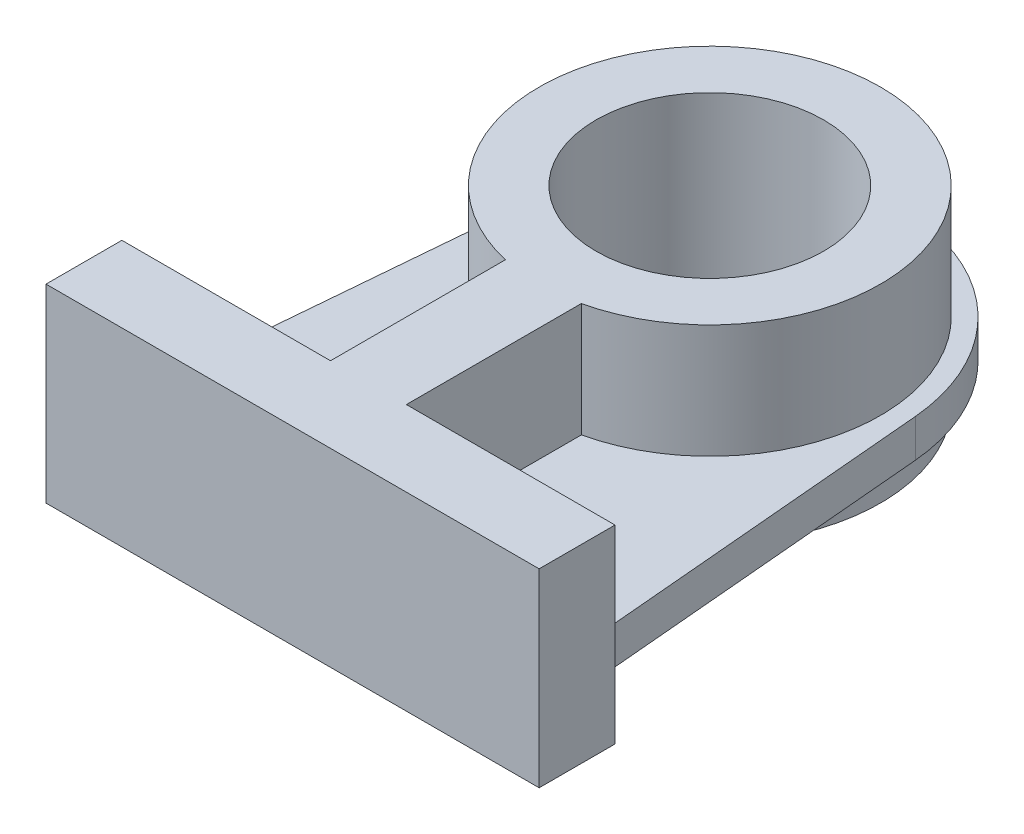
ISO-10303-21;
HEADER;
FILE_DESCRIPTION(('STEP AP214'),'2;1');
FILE_NAME('part.step','',(''),(''),'','','');
FILE_SCHEMA(('AUTOMOTIVE_DESIGN { 1 0 10303 214 1 1 1 1 }'));
ENDSEC;
DATA;
#1=APPLICATION_CONTEXT('core data for automotive mechanical design processes');
#2=APPLICATION_PROTOCOL_DEFINITION('international standard','automotive_design',2000,#1);
#3=PRODUCT_CONTEXT('',#1,'mechanical');
#4=PRODUCT('Part','Part','',(#3));
#5=PRODUCT_RELATED_PRODUCT_CATEGORY('part','',(#4));
#6=PRODUCT_DEFINITION_FORMATION('','',#4);
#7=PRODUCT_DEFINITION_CONTEXT('part definition',#1,'design');
#8=PRODUCT_DEFINITION('design','',#6,#7);
#9=PRODUCT_DEFINITION_SHAPE('','',#8);
#10=(LENGTH_UNIT() NAMED_UNIT(*) SI_UNIT(.MILLI.,.METRE.));
#11=(NAMED_UNIT(*) PLANE_ANGLE_UNIT() SI_UNIT($,.RADIAN.));
#12=(NAMED_UNIT(*) SI_UNIT($,.STERADIAN.) SOLID_ANGLE_UNIT());
#13=UNCERTAINTY_MEASURE_WITH_UNIT(LENGTH_MEASURE(1.E-05),#10,'distance_accuracy_value','');
#14=(GEOMETRIC_REPRESENTATION_CONTEXT(3) GLOBAL_UNCERTAINTY_ASSIGNED_CONTEXT((#13)) GLOBAL_UNIT_ASSIGNED_CONTEXT((#10,
#11,#12)) REPRESENTATION_CONTEXT('',''));
#15=CARTESIAN_POINT('',(0.,0.,0.));
#16=DIRECTION('',(0.,0.,1.));
#17=DIRECTION('',(1.,0.,0.));
#18=AXIS2_PLACEMENT_3D('',#15,#16,#17);
#19=CARTESIAN_POINT('',(0.,25.,0.));
#20=DIRECTION('',(0.,-1.,0.));
#21=DIRECTION('',(0.,0.,-1.));
#22=AXIS2_PLACEMENT_3D('',#19,#20,#21);
#23=CYLINDRICAL_SURFACE('',#22,22.5);
#24=CARTESIAN_POINT('',(0.,5.,0.));
#25=DIRECTION('',(0.,1.,0.));
#26=DIRECTION('',(0.,0.,1.));
#27=AXIS2_PLACEMENT_3D('',#24,#25,#26);
#28=CIRCLE('',#27,22.5);
#29=CARTESIAN_POINT('',(4.99999999999999,5.,21.9374109684803));
#30=VERTEX_POINT('',#29);
#31=CARTESIAN_POINT('',(-5.00000000000001,5.,21.9374109684803));
#32=VERTEX_POINT('',#31);
#33=EDGE_CURVE('E206',#30,#32,#28,.T.);
#34=ORIENTED_EDGE('',*,*,#33,.F.);
#35=DIRECTION('',(0.,-1.,0.));
#36=VECTOR('',#35,1.);
#37=CARTESIAN_POINT('',(4.99999999999999,25.,21.9374109684803));
#38=LINE('',#37,#36);
#39=CARTESIAN_POINT('',(4.99999999999999,0.,21.9374109684803));
#40=VERTEX_POINT('',#39);
#41=EDGE_CURVE('E107',#30,#40,#38,.T.);
#42=ORIENTED_EDGE('',*,*,#41,.T.);
#43=CARTESIAN_POINT('',(0.,0.,0.));
#44=DIRECTION('',(0.,1.,0.));
#45=DIRECTION('',(0.,0.,1.));
#46=AXIS2_PLACEMENT_3D('',#43,#44,#45);
#47=CIRCLE('',#46,22.5);
#48=CARTESIAN_POINT('',(-5.00000000000001,0.,21.9374109684803));
#49=VERTEX_POINT('',#48);
#50=EDGE_CURVE('E189',#40,#49,#47,.T.);
#51=ORIENTED_EDGE('',*,*,#50,.T.);
#52=DIRECTION('',(0.,-1.,0.));
#53=VECTOR('',#52,1.);
#54=CARTESIAN_POINT('',(-5.00000000000001,25.,21.9374109684803));
#55=LINE('',#54,#53);
#56=EDGE_CURVE('E56',#32,#49,#55,.T.);
#57=ORIENTED_EDGE('',*,*,#56,.F.);
#58=EDGE_LOOP('',(#34,#42,#51,#57));
#59=FACE_BOUND('',#58,.T.);
#60=ADVANCED_FACE('F47',(#59),#23,.T.);
#61=CARTESIAN_POINT('',(-5.00000000000001,25.,0.));
#62=DIRECTION('',(1.,0.,0.));
#63=DIRECTION('',(0.,0.,-1.));
#64=AXIS2_PLACEMENT_3D('',#61,#62,#63);
#65=PLANE('',#64);
#66=DIRECTION('',(0.,0.,1.));
#67=VECTOR('',#66,1.);
#68=CARTESIAN_POINT('',(-5.00000000000001,5.,0.));
#69=LINE('',#68,#67);
#70=CARTESIAN_POINT('',(-5.00000000000001,5.,45.));
#71=VERTEX_POINT('',#70);
#72=EDGE_CURVE('E210',#32,#71,#69,.T.);
#73=ORIENTED_EDGE('',*,*,#72,.F.);
#74=ORIENTED_EDGE('',*,*,#56,.T.);
#75=DIRECTION('',(0.,0.,1.));
#76=VECTOR('',#75,1.);
#77=CARTESIAN_POINT('',(-5.00000000000001,0.,0.));
#78=LINE('',#77,#76);
#79=CARTESIAN_POINT('',(-5.00000000000001,0.,45.));
#80=VERTEX_POINT('',#79);
#81=EDGE_CURVE('E342',#49,#80,#78,.T.);
#82=ORIENTED_EDGE('',*,*,#81,.T.);
#83=DIRECTION('',(0.,-1.,0.));
#84=VECTOR('',#83,1.);
#85=CARTESIAN_POINT('',(-5.00000000000001,25.,45.));
#86=LINE('',#85,#84);
#87=EDGE_CURVE('E329',#71,#80,#86,.T.);
#88=ORIENTED_EDGE('',*,*,#87,.F.);
#89=EDGE_LOOP('',(#73,#74,#82,#88));
#90=FACE_BOUND('',#89,.T.);
#91=ADVANCED_FACE('F343',(#90),#65,.F.);
#92=CARTESIAN_POINT('',(4.99999999999999,25.,0.));
#93=DIRECTION('',(1.,0.,0.));
#94=DIRECTION('',(0.,0.,-1.));
#95=AXIS2_PLACEMENT_3D('',#92,#93,#94);
#96=PLANE('',#95);
#97=ORIENTED_EDGE('',*,*,#41,.F.);
#98=DIRECTION('',(0.,0.,1.));
#99=VECTOR('',#98,1.);
#100=CARTESIAN_POINT('',(4.99999999999999,5.,0.));
#101=LINE('',#100,#99);
#102=CARTESIAN_POINT('',(5.,5.,45.));
#103=VERTEX_POINT('',#102);
#104=EDGE_CURVE('E203',#30,#103,#101,.T.);
#105=ORIENTED_EDGE('',*,*,#104,.T.);
#106=DIRECTION('',(0.,-1.,0.));
#107=VECTOR('',#106,1.);
#108=CARTESIAN_POINT('',(5.,25.,45.));
#109=LINE('',#108,#107);
#110=CARTESIAN_POINT('',(5.,0.,45.));
#111=VERTEX_POINT('',#110);
#112=EDGE_CURVE('E272',#103,#111,#109,.T.);
#113=ORIENTED_EDGE('',*,*,#112,.T.);
#114=DIRECTION('',(0.,0.,1.));
#115=VECTOR('',#114,1.);
#116=CARTESIAN_POINT('',(4.99999999999999,0.,0.));
#117=LINE('',#116,#115);
#118=EDGE_CURVE('E360',#40,#111,#117,.T.);
#119=ORIENTED_EDGE('',*,*,#118,.F.);
#120=EDGE_LOOP('',(#97,#105,#113,#119));
#121=FACE_BOUND('',#120,.T.);
#122=ADVANCED_FACE('F383',(#121),#96,.T.);
#123=CARTESIAN_POINT('',(4.99999999999999,25.,21.9374109684803));
#124=VERTEX_POINT('',#123);
#125=CARTESIAN_POINT('',(4.99999999999999,10.,21.9374109684803));
#126=VERTEX_POINT('',#125);
#127=EDGE_CURVE('E72',#124,#126,#38,.T.);
#128=ORIENTED_EDGE('',*,*,#127,.T.);
#129=CARTESIAN_POINT('',(0.,10.,0.));
#130=DIRECTION('',(0.,1.,0.));
#131=DIRECTION('',(0.,0.,1.));
#132=AXIS2_PLACEMENT_3D('',#129,#130,#131);
#133=CIRCLE('',#132,22.5);
#134=CARTESIAN_POINT('',(-5.00000000000001,10.,21.9374109684803));
#135=VERTEX_POINT('',#134);
#136=EDGE_CURVE('E233',#126,#135,#133,.T.);
#137=ORIENTED_EDGE('',*,*,#136,.T.);
#138=CARTESIAN_POINT('',(-5.00000000000001,25.,21.9374109684803));
#139=VERTEX_POINT('',#138);
#140=EDGE_CURVE('E11',#139,#135,#55,.T.);
#141=ORIENTED_EDGE('',*,*,#140,.F.);
#142=CARTESIAN_POINT('',(0.,25.,0.));
#143=DIRECTION('',(0.,1.,0.));
#144=DIRECTION('',(0.,0.,1.));
#145=AXIS2_PLACEMENT_3D('',#142,#143,#144);
#146=CIRCLE('',#145,22.5);
#147=EDGE_CURVE('E180',#124,#139,#146,.T.);
#148=ORIENTED_EDGE('',*,*,#147,.F.);
#149=EDGE_LOOP('',(#128,#137,#141,#148));
#150=FACE_BOUND('',#149,.T.);
#151=ADVANCED_FACE('F49',(#150),#23,.T.);
#152=ORIENTED_EDGE('',*,*,#140,.T.);
#153=DIRECTION('',(0.,0.,1.));
#154=VECTOR('',#153,1.);
#155=CARTESIAN_POINT('',(-5.00000000000001,10.,0.));
#156=LINE('',#155,#154);
#157=CARTESIAN_POINT('',(-5.00000000000001,10.,45.));
#158=VERTEX_POINT('',#157);
#159=EDGE_CURVE('E237',#135,#158,#156,.T.);
#160=ORIENTED_EDGE('',*,*,#159,.T.);
#161=CARTESIAN_POINT('',(-5.00000000000001,25.,45.));
#162=VERTEX_POINT('',#161);
#163=EDGE_CURVE('E311',#162,#158,#86,.T.);
#164=ORIENTED_EDGE('',*,*,#163,.F.);
#165=DIRECTION('',(0.,0.,1.));
#166=VECTOR('',#165,1.);
#167=CARTESIAN_POINT('',(-5.00000000000001,25.,0.));
#168=LINE('',#167,#166);
#169=EDGE_CURVE('E115',#139,#162,#168,.T.);
#170=ORIENTED_EDGE('',*,*,#169,.F.);
#171=EDGE_LOOP('',(#152,#160,#164,#170));
#172=FACE_BOUND('',#171,.T.);
#173=ADVANCED_FACE('F312',(#172),#65,.F.);
#174=CARTESIAN_POINT('',(0.,25.,45.));
#175=DIRECTION('',(0.,0.,1.));
#176=DIRECTION('',(1.,0.,0.));
#177=AXIS2_PLACEMENT_3D('',#174,#175,#176);
#178=PLANE('',#177);
#179=ORIENTED_EDGE('',*,*,#163,.T.);
#180=DIRECTION('',(-1.,0.,0.));
#181=VECTOR('',#180,1.);
#182=CARTESIAN_POINT('',(0.,10.,45.));
#183=LINE('',#182,#181);
#184=CARTESIAN_POINT('',(-29.0324857972501,10.,45.));
#185=VERTEX_POINT('',#184);
#186=EDGE_CURVE('E241',#158,#185,#183,.T.);
#187=ORIENTED_EDGE('',*,*,#186,.T.);
#188=DIRECTION('',(0.,-1.,0.));
#189=VECTOR('',#188,1.);
#190=CARTESIAN_POINT('',(-29.0324857972501,10.,45.));
#191=LINE('',#190,#189);
#192=CARTESIAN_POINT('',(-29.0324857972501,5.,45.));
#193=VERTEX_POINT('',#192);
#194=EDGE_CURVE('E194',#185,#193,#191,.T.);
#195=ORIENTED_EDGE('',*,*,#194,.T.);
#196=DIRECTION('',(-1.,0.,0.));
#197=VECTOR('',#196,1.);
#198=CARTESIAN_POINT('',(0.,5.,45.));
#199=LINE('',#198,#197);
#200=EDGE_CURVE('E214',#71,#193,#199,.T.);
#201=ORIENTED_EDGE('',*,*,#200,.F.);
#202=ORIENTED_EDGE('',*,*,#87,.T.);
#203=DIRECTION('',(-1.,0.,0.));
#204=VECTOR('',#203,1.);
#205=CARTESIAN_POINT('',(0.,0.,45.));
#206=LINE('',#205,#204);
#207=CARTESIAN_POINT('',(-32.5,0.,45.));
#208=VERTEX_POINT('',#207);
#209=EDGE_CURVE('E337',#80,#208,#206,.T.);
#210=ORIENTED_EDGE('',*,*,#209,.T.);
#211=DIRECTION('',(0.,-1.,0.));
#212=VECTOR('',#211,1.);
#213=CARTESIAN_POINT('',(-32.5,25.,45.));
#214=LINE('',#213,#212);
#215=CARTESIAN_POINT('',(-32.5,25.,45.));
#216=VERTEX_POINT('',#215);
#217=EDGE_CURVE('E327',#216,#208,#214,.T.);
#218=ORIENTED_EDGE('',*,*,#217,.F.);
#219=DIRECTION('',(-1.,0.,0.));
#220=VECTOR('',#219,1.);
#221=CARTESIAN_POINT('',(0.,25.,45.));
#222=LINE('',#221,#220);
#223=EDGE_CURVE('E167',#162,#216,#222,.T.);
#224=ORIENTED_EDGE('',*,*,#223,.F.);
#225=EDGE_LOOP('',(#179,#187,#195,#201,#202,#210,#218,#224));
#226=FACE_BOUND('',#225,.T.);
#227=ADVANCED_FACE('F310',(#226),#178,.F.);
#228=CARTESIAN_POINT('',(-32.5,25.,0.));
#229=DIRECTION('',(-1.,0.,0.));
#230=DIRECTION('',(0.,0.,1.));
#231=AXIS2_PLACEMENT_3D('',#228,#229,#230);
#232=PLANE('',#231);
#233=DIRECTION('',(0.,0.,-1.));
#234=VECTOR('',#233,1.);
#235=CARTESIAN_POINT('',(-32.5,0.,0.));
#236=LINE('',#235,#234);
#237=CARTESIAN_POINT('',(-32.5,0.,55.));
#238=VERTEX_POINT('',#237);
#239=EDGE_CURVE('E352',#238,#208,#236,.T.);
#240=ORIENTED_EDGE('',*,*,#239,.F.);
#241=DIRECTION('',(0.,-1.,0.));
#242=VECTOR('',#241,1.);
#243=CARTESIAN_POINT('',(-32.5,25.,55.));
#244=LINE('',#243,#242);
#245=CARTESIAN_POINT('',(-32.5,25.,55.));
#246=VERTEX_POINT('',#245);
#247=EDGE_CURVE('E324',#246,#238,#244,.T.);
#248=ORIENTED_EDGE('',*,*,#247,.F.);
#249=DIRECTION('',(0.,0.,-1.));
#250=VECTOR('',#249,1.);
#251=CARTESIAN_POINT('',(-32.5,25.,0.));
#252=LINE('',#251,#250);
#253=EDGE_CURVE('E174',#246,#216,#252,.T.);
#254=ORIENTED_EDGE('',*,*,#253,.T.);
#255=ORIENTED_EDGE('',*,*,#217,.T.);
#256=EDGE_LOOP('',(#240,#248,#254,#255));
#257=FACE_BOUND('',#256,.T.);
#258=ADVANCED_FACE('F406',(#257),#232,.T.);
#259=CARTESIAN_POINT('',(0.,25.,55.));
#260=DIRECTION('',(0.,0.,1.));
#261=DIRECTION('',(1.,0.,0.));
#262=AXIS2_PLACEMENT_3D('',#259,#260,#261);
#263=PLANE('',#262);
#264=DIRECTION('',(-1.,0.,0.));
#265=VECTOR('',#264,1.);
#266=CARTESIAN_POINT('',(0.,0.,55.));
#267=LINE('',#266,#265);
#268=CARTESIAN_POINT('',(32.5,0.,55.));
#269=VERTEX_POINT('',#268);
#270=EDGE_CURVE('E357',#269,#238,#267,.T.);
#271=ORIENTED_EDGE('',*,*,#270,.F.);
#272=DIRECTION('',(0.,-1.,0.));
#273=VECTOR('',#272,1.);
#274=CARTESIAN_POINT('',(32.5,25.,55.));
#275=LINE('',#274,#273);
#276=CARTESIAN_POINT('',(32.5,25.,55.));
#277=VERTEX_POINT('',#276);
#278=EDGE_CURVE('E157',#277,#269,#275,.T.);
#279=ORIENTED_EDGE('',*,*,#278,.F.);
#280=DIRECTION('',(-1.,0.,0.));
#281=VECTOR('',#280,1.);
#282=CARTESIAN_POINT('',(0.,25.,55.));
#283=LINE('',#282,#281);
#284=EDGE_CURVE('E144',#277,#246,#283,.T.);
#285=ORIENTED_EDGE('',*,*,#284,.T.);
#286=ORIENTED_EDGE('',*,*,#247,.T.);
#287=EDGE_LOOP('',(#271,#279,#285,#286));
#288=FACE_BOUND('',#287,.T.);
#289=ADVANCED_FACE('F403',(#288),#263,.T.);
#290=CARTESIAN_POINT('',(32.4999999999999,25.,0.));
#291=DIRECTION('',(-1.,0.,0.));
#292=DIRECTION('',(0.,0.,1.));
#293=AXIS2_PLACEMENT_3D('',#290,#291,#292);
#294=PLANE('',#293);
#295=DIRECTION('',(0.,0.,-1.));
#296=VECTOR('',#295,1.);
#297=CARTESIAN_POINT('',(32.4999999999999,0.,0.));
#298=LINE('',#297,#296);
#299=CARTESIAN_POINT('',(32.5,0.,45.));
#300=VERTEX_POINT('',#299);
#301=EDGE_CURVE('E152',#269,#300,#298,.T.);
#302=ORIENTED_EDGE('',*,*,#301,.T.);
#303=DIRECTION('',(0.,-1.,0.));
#304=VECTOR('',#303,1.);
#305=CARTESIAN_POINT('',(32.5,25.,45.));
#306=LINE('',#305,#304);
#307=CARTESIAN_POINT('',(32.5,25.,45.));
#308=VERTEX_POINT('',#307);
#309=EDGE_CURVE('E149',#308,#300,#306,.T.);
#310=ORIENTED_EDGE('',*,*,#309,.F.);
#311=DIRECTION('',(0.,0.,-1.));
#312=VECTOR('',#311,1.);
#313=CARTESIAN_POINT('',(32.4999999999999,25.,0.));
#314=LINE('',#313,#312);
#315=EDGE_CURVE('E134',#277,#308,#314,.T.);
#316=ORIENTED_EDGE('',*,*,#315,.F.);
#317=ORIENTED_EDGE('',*,*,#278,.T.);
#318=EDGE_LOOP('',(#302,#310,#316,#317));
#319=FACE_BOUND('',#318,.T.);
#320=ADVANCED_FACE('F150',(#319),#294,.F.);
#321=DIRECTION('',(0.,-1.,0.));
#322=VECTOR('',#321,1.);
#323=CARTESIAN_POINT('',(29.0324857972501,10.,45.));
#324=LINE('',#323,#322);
#325=CARTESIAN_POINT('',(29.0324857972501,10.,45.));
#326=VERTEX_POINT('',#325);
#327=CARTESIAN_POINT('',(29.0324857972501,5.,45.));
#328=VERTEX_POINT('',#327);
#329=EDGE_CURVE('E198',#326,#328,#324,.T.);
#330=ORIENTED_EDGE('',*,*,#329,.F.);
#331=CARTESIAN_POINT('',(5.,10.,45.));
#332=VERTEX_POINT('',#331);
#333=EDGE_CURVE('E202',#326,#332,#183,.T.);
#334=ORIENTED_EDGE('',*,*,#333,.T.);
#335=CARTESIAN_POINT('',(5.,25.,45.));
#336=VERTEX_POINT('',#335);
#337=EDGE_CURVE('E158',#336,#332,#109,.T.);
#338=ORIENTED_EDGE('',*,*,#337,.F.);
#339=EDGE_CURVE('E140',#308,#336,#222,.T.);
#340=ORIENTED_EDGE('',*,*,#339,.F.);
#341=ORIENTED_EDGE('',*,*,#309,.T.);
#342=EDGE_CURVE('E355',#300,#111,#206,.T.);
#343=ORIENTED_EDGE('',*,*,#342,.T.);
#344=ORIENTED_EDGE('',*,*,#112,.F.);
#345=EDGE_CURVE('E63',#328,#103,#199,.T.);
#346=ORIENTED_EDGE('',*,*,#345,.F.);
#347=EDGE_LOOP('',(#330,#334,#338,#340,#341,#343,#344,#346));
#348=FACE_BOUND('',#347,.T.);
#349=ADVANCED_FACE('F161',(#348),#178,.F.);
#350=DIRECTION('',(0.,0.,1.));
#351=VECTOR('',#350,1.);
#352=CARTESIAN_POINT('',(4.99999999999999,10.,0.));
#353=LINE('',#352,#351);
#354=EDGE_CURVE('E229',#126,#332,#353,.T.);
#355=ORIENTED_EDGE('',*,*,#354,.F.);
#356=ORIENTED_EDGE('',*,*,#127,.F.);
#357=DIRECTION('',(0.,0.,1.));
#358=VECTOR('',#357,1.);
#359=CARTESIAN_POINT('',(4.99999999999999,25.,0.));
#360=LINE('',#359,#358);
#361=EDGE_CURVE('E165',#124,#336,#360,.T.);
#362=ORIENTED_EDGE('',*,*,#361,.T.);
#363=ORIENTED_EDGE('',*,*,#337,.T.);
#364=EDGE_LOOP('',(#355,#356,#362,#363));
#365=FACE_BOUND('',#364,.T.);
#366=ADVANCED_FACE('F315',(#365),#96,.T.);
#367=CARTESIAN_POINT('',(0.,25.,0.));
#368=DIRECTION('',(0.,-1.,0.));
#369=DIRECTION('',(0.,0.,-1.));
#370=AXIS2_PLACEMENT_3D('',#367,#368,#369);
#371=CYLINDRICAL_SURFACE('',#370,15.);
#372=CARTESIAN_POINT('',(0.,25.,0.));
#373=DIRECTION('',(0.,1.,0.));
#374=DIRECTION('',(0.,0.,1.));
#375=AXIS2_PLACEMENT_3D('',#372,#373,#374);
#376=CIRCLE('',#375,15.);
#377=CARTESIAN_POINT('',(0.,25.,15.));
#378=VERTEX_POINT('',#377);
#379=EDGE_CURVE('E169',#378,#378,#376,.T.);
#380=ORIENTED_EDGE('',*,*,#379,.T.);
#381=EDGE_LOOP('',(#380));
#382=FACE_BOUND('',#381,.T.);
#383=CARTESIAN_POINT('',(0.,0.,0.));
#384=DIRECTION('',(0.,1.,0.));
#385=DIRECTION('',(0.,0.,1.));
#386=AXIS2_PLACEMENT_3D('',#383,#384,#385);
#387=CIRCLE('',#386,15.);
#388=CARTESIAN_POINT('',(0.,0.,15.));
#389=VERTEX_POINT('',#388);
#390=EDGE_CURVE('E182',#389,#389,#387,.T.);
#391=ORIENTED_EDGE('',*,*,#390,.F.);
#392=EDGE_LOOP('',(#391));
#393=FACE_BOUND('',#392,.T.);
#394=ADVANCED_FACE('F372',(#382,#393),#371,.F.);
#395=CARTESIAN_POINT('',(0.,25.,0.));
#396=DIRECTION('',(0.,1.,0.));
#397=DIRECTION('',(0.,0.,1.));
#398=AXIS2_PLACEMENT_3D('',#395,#396,#397);
#399=PLANE('',#398);
#400=ORIENTED_EDGE('',*,*,#147,.T.);
#401=ORIENTED_EDGE('',*,*,#169,.T.);
#402=ORIENTED_EDGE('',*,*,#223,.T.);
#403=ORIENTED_EDGE('',*,*,#253,.F.);
#404=ORIENTED_EDGE('',*,*,#284,.F.);
#405=ORIENTED_EDGE('',*,*,#315,.T.);
#406=ORIENTED_EDGE('',*,*,#339,.T.);
#407=ORIENTED_EDGE('',*,*,#361,.F.);
#408=EDGE_LOOP('',(#400,#401,#402,#403,#404,#405,#406,#407));
#409=FACE_BOUND('',#408,.T.);
#410=ORIENTED_EDGE('',*,*,#379,.F.);
#411=EDGE_LOOP('',(#410));
#412=FACE_BOUND('',#411,.T.);
#413=ADVANCED_FACE('F136',(#409,#412),#399,.T.);
#414=CARTESIAN_POINT('',(0.,0.,0.));
#415=DIRECTION('',(0.,1.,0.));
#416=DIRECTION('',(0.,0.,1.));
#417=AXIS2_PLACEMENT_3D('',#414,#415,#416);
#418=PLANE('',#417);
#419=ORIENTED_EDGE('',*,*,#50,.F.);
#420=ORIENTED_EDGE('',*,*,#118,.T.);
#421=ORIENTED_EDGE('',*,*,#342,.F.);
#422=ORIENTED_EDGE('',*,*,#301,.F.);
#423=ORIENTED_EDGE('',*,*,#270,.T.);
#424=ORIENTED_EDGE('',*,*,#239,.T.);
#425=ORIENTED_EDGE('',*,*,#209,.F.);
#426=ORIENTED_EDGE('',*,*,#81,.F.);
#427=EDGE_LOOP('',(#419,#420,#421,#422,#423,#424,#425,#426));
#428=FACE_BOUND('',#427,.T.);
#429=ORIENTED_EDGE('',*,*,#390,.T.);
#430=EDGE_LOOP('',(#429));
#431=FACE_BOUND('',#430,.T.);
#432=ADVANCED_FACE('F348',(#428,#431),#418,.F.);
#433=CARTESIAN_POINT('',(24.9048674522936,10.,-2.17889356869136));
#434=DIRECTION('',(0.996194698091746,0.,-0.0871557427476544));
#435=DIRECTION('',(-0.0871557427476544,0.,-0.996194698091746));
#436=AXIS2_PLACEMENT_3D('',#433,#434,#435);
#437=PLANE('',#436);
#438=DIRECTION('',(0.0871557427476544,0.,0.996194698091746));
#439=VECTOR('',#438,1.);
#440=CARTESIAN_POINT('',(24.9048674522936,5.,-2.17889356869136));
#441=LINE('',#440,#439);
#442=CARTESIAN_POINT('',(24.9048674522936,5.,-2.17889356869136));
#443=VERTEX_POINT('',#442);
#444=EDGE_CURVE('E226',#443,#328,#441,.T.);
#445=ORIENTED_EDGE('',*,*,#444,.F.);
#446=DIRECTION('',(0.,-1.,0.));
#447=VECTOR('',#446,1.);
#448=CARTESIAN_POINT('',(24.9048674522936,10.,-2.17889356869136));
#449=LINE('',#448,#447);
#450=CARTESIAN_POINT('',(24.9048674522936,10.,-2.17889356869136));
#451=VERTEX_POINT('',#450);
#452=EDGE_CURVE('E185',#451,#443,#449,.T.);
#453=ORIENTED_EDGE('',*,*,#452,.F.);
#454=DIRECTION('',(0.0871557427476544,0.,0.996194698091746));
#455=VECTOR('',#454,1.);
#456=CARTESIAN_POINT('',(24.9048674522936,10.,-2.17889356869136));
#457=LINE('',#456,#455);
#458=EDGE_CURVE('E253',#451,#326,#457,.T.);
#459=ORIENTED_EDGE('',*,*,#458,.T.);
#460=ORIENTED_EDGE('',*,*,#329,.T.);
#461=EDGE_LOOP('',(#445,#453,#459,#460));
#462=FACE_BOUND('',#461,.T.);
#463=ADVANCED_FACE('F262',(#462),#437,.T.);
#464=CARTESIAN_POINT('',(0.,10.,0.));
#465=DIRECTION('',(0.,-1.,0.));
#466=DIRECTION('',(0.,0.,-1.));
#467=AXIS2_PLACEMENT_3D('',#464,#465,#466);
#468=CYLINDRICAL_SURFACE('',#467,25.);
#469=CARTESIAN_POINT('',(0.,5.,0.));
#470=DIRECTION('',(0.,1.,0.));
#471=DIRECTION('',(0.,0.,1.));
#472=AXIS2_PLACEMENT_3D('',#469,#470,#471);
#473=CIRCLE('',#472,25.);
#474=CARTESIAN_POINT('',(-24.9048674522936,5.,-2.17889356869135));
#475=VERTEX_POINT('',#474);
#476=EDGE_CURVE('E222',#443,#475,#473,.T.);
#477=ORIENTED_EDGE('',*,*,#476,.T.);
#478=DIRECTION('',(0.,-1.,0.));
#479=VECTOR('',#478,1.);
#480=CARTESIAN_POINT('',(-24.9048674522936,10.,-2.17889356869135));
#481=LINE('',#480,#479);
#482=CARTESIAN_POINT('',(-24.9048674522936,10.,-2.17889356869135));
#483=VERTEX_POINT('',#482);
#484=EDGE_CURVE('E190',#483,#475,#481,.T.);
#485=ORIENTED_EDGE('',*,*,#484,.F.);
#486=CARTESIAN_POINT('',(0.,10.,0.));
#487=DIRECTION('',(0.,1.,0.));
#488=DIRECTION('',(0.,0.,1.));
#489=AXIS2_PLACEMENT_3D('',#486,#487,#488);
#490=CIRCLE('',#489,25.);
#491=EDGE_CURVE('E249',#451,#483,#490,.T.);
#492=ORIENTED_EDGE('',*,*,#491,.F.);
#493=ORIENTED_EDGE('',*,*,#452,.T.);
#494=EDGE_LOOP('',(#477,#485,#492,#493));
#495=FACE_BOUND('',#494,.T.);
#496=ADVANCED_FACE('F302',(#495),#468,.T.);
#497=CARTESIAN_POINT('',(-24.9048674522936,10.,-2.17889356869136));
#498=DIRECTION('',(0.996194698091746,0.,0.0871557427476544));
#499=DIRECTION('',(0.0871557427476544,0.,-0.996194698091746));
#500=AXIS2_PLACEMENT_3D('',#497,#498,#499);
#501=PLANE('',#500);
#502=DIRECTION('',(-0.0871557427476544,0.,0.996194698091746));
#503=VECTOR('',#502,1.);
#504=CARTESIAN_POINT('',(-24.9048674522936,5.,-2.17889356869136));
#505=LINE('',#504,#503);
#506=EDGE_CURVE('E218',#475,#193,#505,.T.);
#507=ORIENTED_EDGE('',*,*,#506,.T.);
#508=ORIENTED_EDGE('',*,*,#194,.F.);
#509=DIRECTION('',(-0.0871557427476544,0.,0.996194698091746));
#510=VECTOR('',#509,1.);
#511=CARTESIAN_POINT('',(-24.9048674522936,10.,-2.17889356869136));
#512=LINE('',#511,#510);
#513=EDGE_CURVE('E245',#483,#185,#512,.T.);
#514=ORIENTED_EDGE('',*,*,#513,.F.);
#515=ORIENTED_EDGE('',*,*,#484,.T.);
#516=EDGE_LOOP('',(#507,#508,#514,#515));
#517=FACE_BOUND('',#516,.T.);
#518=ADVANCED_FACE('F306',(#517),#501,.F.);
#519=CARTESIAN_POINT('',(0.,10.,0.));
#520=DIRECTION('',(0.,1.,0.));
#521=DIRECTION('',(0.,0.,1.));
#522=AXIS2_PLACEMENT_3D('',#519,#520,#521);
#523=PLANE('',#522);
#524=ORIENTED_EDGE('',*,*,#458,.F.);
#525=ORIENTED_EDGE('',*,*,#491,.T.);
#526=ORIENTED_EDGE('',*,*,#513,.T.);
#527=ORIENTED_EDGE('',*,*,#186,.F.);
#528=ORIENTED_EDGE('',*,*,#159,.F.);
#529=ORIENTED_EDGE('',*,*,#136,.F.);
#530=ORIENTED_EDGE('',*,*,#354,.T.);
#531=ORIENTED_EDGE('',*,*,#333,.F.);
#532=EDGE_LOOP('',(#524,#525,#526,#527,#528,#529,#530,#531));
#533=FACE_BOUND('',#532,.T.);
#534=ADVANCED_FACE('F268',(#533),#523,.T.);
#535=CARTESIAN_POINT('',(0.,5.,0.));
#536=DIRECTION('',(0.,1.,0.));
#537=DIRECTION('',(0.,0.,1.));
#538=AXIS2_PLACEMENT_3D('',#535,#536,#537);
#539=PLANE('',#538);
#540=ORIENTED_EDGE('',*,*,#444,.T.);
#541=ORIENTED_EDGE('',*,*,#345,.T.);
#542=ORIENTED_EDGE('',*,*,#104,.F.);
#543=ORIENTED_EDGE('',*,*,#33,.T.);
#544=ORIENTED_EDGE('',*,*,#72,.T.);
#545=ORIENTED_EDGE('',*,*,#200,.T.);
#546=ORIENTED_EDGE('',*,*,#506,.F.);
#547=ORIENTED_EDGE('',*,*,#476,.F.);
#548=EDGE_LOOP('',(#540,#541,#542,#543,#544,#545,#546,#547));
#549=FACE_BOUND('',#548,.T.);
#550=ADVANCED_FACE('F423',(#549),#539,.F.);
#551=CLOSED_SHELL('',(#60,#91,#122,#151,#173,#227,#258,#289,#320,#349,#366,#394,#413,#432,#463,
#496,#518,#534,#550));
#552=MANIFOLD_SOLID_BREP('B2',#551);
#553=ADVANCED_BREP_SHAPE_REPRESENTATION('',(#18,#552),#14);
#554=SHAPE_DEFINITION_REPRESENTATION(#9,#553);
ENDSEC;
END-ISO-10303-21;
